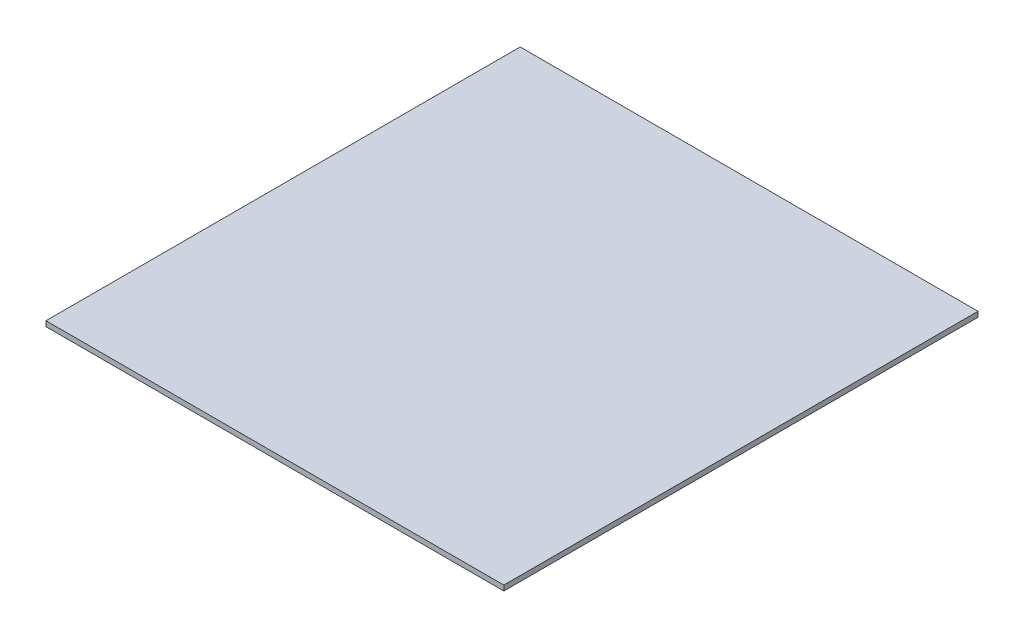
ISO-10303-21;
HEADER;
FILE_DESCRIPTION(('STEP AP214'),'2;1');
FILE_NAME('part.step','',(''),(''),'','','');
FILE_SCHEMA(('AUTOMOTIVE_DESIGN { 1 0 10303 214 1 1 1 1 }'));
ENDSEC;
DATA;
#1=APPLICATION_CONTEXT('core data for automotive mechanical design processes');
#2=APPLICATION_PROTOCOL_DEFINITION('international standard','automotive_design',2000,#1);
#3=PRODUCT_CONTEXT('',#1,'mechanical');
#4=PRODUCT('Part','Part','',(#3));
#5=PRODUCT_RELATED_PRODUCT_CATEGORY('part','',(#4));
#6=PRODUCT_DEFINITION_FORMATION('','',#4);
#7=PRODUCT_DEFINITION_CONTEXT('part definition',#1,'design');
#8=PRODUCT_DEFINITION('design','',#6,#7);
#9=PRODUCT_DEFINITION_SHAPE('','',#8);
#10=(LENGTH_UNIT() NAMED_UNIT(*) SI_UNIT(.MILLI.,.METRE.));
#11=(NAMED_UNIT(*) PLANE_ANGLE_UNIT() SI_UNIT($,.RADIAN.));
#12=(NAMED_UNIT(*) SI_UNIT($,.STERADIAN.) SOLID_ANGLE_UNIT());
#13=UNCERTAINTY_MEASURE_WITH_UNIT(LENGTH_MEASURE(1.E-05),#10,'distance_accuracy_value','');
#14=(GEOMETRIC_REPRESENTATION_CONTEXT(3) GLOBAL_UNCERTAINTY_ASSIGNED_CONTEXT((#13)) GLOBAL_UNIT_ASSIGNED_CONTEXT((#10,
#11,#12)) REPRESENTATION_CONTEXT('',''));
#15=CARTESIAN_POINT('',(0.,0.,0.));
#16=DIRECTION('',(0.,0.,1.));
#17=DIRECTION('',(1.,0.,0.));
#18=AXIS2_PLACEMENT_3D('',#15,#16,#17);
#19=CARTESIAN_POINT('',(140.,1.5875,290.));
#20=DIRECTION('',(-1.,0.,0.));
#21=DIRECTION('',(0.,0.,1.));
#22=AXIS2_PLACEMENT_3D('',#19,#20,#21);
#23=PLANE('',#22);
#24=DIRECTION('',(0.,1.,0.));
#25=VECTOR('',#24,1.);
#26=CARTESIAN_POINT('',(140.,1.5875,0.));
#27=LINE('',#26,#25);
#28=CARTESIAN_POINT('',(140.,-1.5875,0.));
#29=VERTEX_POINT('',#28);
#30=CARTESIAN_POINT('',(140.,1.5875,0.));
#31=VERTEX_POINT('',#30);
#32=EDGE_CURVE('E104',#29,#31,#27,.T.);
#33=ORIENTED_EDGE('',*,*,#32,.T.);
#34=DIRECTION('',(0.,0.,-1.));
#35=VECTOR('',#34,1.);
#36=CARTESIAN_POINT('',(140.,1.5875,290.));
#37=LINE('',#36,#35);
#38=CARTESIAN_POINT('',(140.,1.5875,290.));
#39=VERTEX_POINT('',#38);
#40=EDGE_CURVE('E11',#39,#31,#37,.T.);
#41=ORIENTED_EDGE('',*,*,#40,.F.);
#42=DIRECTION('',(0.,1.,0.));
#43=VECTOR('',#42,1.);
#44=CARTESIAN_POINT('',(140.,1.5875,290.));
#45=LINE('',#44,#43);
#46=CARTESIAN_POINT('',(140.,-1.5875,290.));
#47=VERTEX_POINT('',#46);
#48=EDGE_CURVE('E92',#47,#39,#45,.T.);
#49=ORIENTED_EDGE('',*,*,#48,.F.);
#50=DIRECTION('',(0.,0.,-1.));
#51=VECTOR('',#50,1.);
#52=CARTESIAN_POINT('',(140.,-1.5875,290.));
#53=LINE('',#52,#51);
#54=EDGE_CURVE('E100',#47,#29,#53,.T.);
#55=ORIENTED_EDGE('',*,*,#54,.T.);
#56=EDGE_LOOP('',(#33,#41,#49,#55));
#57=FACE_BOUND('',#56,.T.);
#58=ADVANCED_FACE('F41',(#57),#23,.F.);
#59=CARTESIAN_POINT('',(-140.,1.5875,290.));
#60=DIRECTION('',(0.,-1.,0.));
#61=DIRECTION('',(0.,0.,-1.));
#62=AXIS2_PLACEMENT_3D('',#59,#60,#61);
#63=PLANE('',#62);
#64=DIRECTION('',(-1.,0.,0.));
#65=VECTOR('',#64,1.);
#66=CARTESIAN_POINT('',(-140.,1.5875,0.));
#67=LINE('',#66,#65);
#68=CARTESIAN_POINT('',(-140.,1.5875,0.));
#69=VERTEX_POINT('',#68);
#70=EDGE_CURVE('E96',#31,#69,#67,.T.);
#71=ORIENTED_EDGE('',*,*,#70,.T.);
#72=DIRECTION('',(0.,0.,-1.));
#73=VECTOR('',#72,1.);
#74=CARTESIAN_POINT('',(-140.,1.5875,290.));
#75=LINE('',#74,#73);
#76=CARTESIAN_POINT('',(-140.,1.5875,290.));
#77=VERTEX_POINT('',#76);
#78=EDGE_CURVE('E49',#77,#69,#75,.T.);
#79=ORIENTED_EDGE('',*,*,#78,.F.);
#80=DIRECTION('',(-1.,0.,0.));
#81=VECTOR('',#80,1.);
#82=CARTESIAN_POINT('',(-140.,1.5875,290.));
#83=LINE('',#82,#81);
#84=EDGE_CURVE('E87',#39,#77,#83,.T.);
#85=ORIENTED_EDGE('',*,*,#84,.F.);
#86=ORIENTED_EDGE('',*,*,#40,.T.);
#87=EDGE_LOOP('',(#71,#79,#85,#86));
#88=FACE_BOUND('',#87,.T.);
#89=ADVANCED_FACE('F95',(#88),#63,.F.);
#90=CARTESIAN_POINT('',(-140.,1.5875,290.));
#91=DIRECTION('',(1.,0.,0.));
#92=DIRECTION('',(0.,0.,-1.));
#93=AXIS2_PLACEMENT_3D('',#90,#91,#92);
#94=PLANE('',#93);
#95=DIRECTION('',(0.,-1.,0.));
#96=VECTOR('',#95,1.);
#97=CARTESIAN_POINT('',(-140.,1.5875,0.));
#98=LINE('',#97,#96);
#99=CARTESIAN_POINT('',(-140.,-1.5875,0.));
#100=VERTEX_POINT('',#99);
#101=EDGE_CURVE('E74',#69,#100,#98,.T.);
#102=ORIENTED_EDGE('',*,*,#101,.T.);
#103=DIRECTION('',(0.,0.,-1.));
#104=VECTOR('',#103,1.);
#105=CARTESIAN_POINT('',(-140.,-1.5875,290.));
#106=LINE('',#105,#104);
#107=CARTESIAN_POINT('',(-140.,-1.5875,290.));
#108=VERTEX_POINT('',#107);
#109=EDGE_CURVE('E97',#108,#100,#106,.T.);
#110=ORIENTED_EDGE('',*,*,#109,.F.);
#111=DIRECTION('',(0.,-1.,0.));
#112=VECTOR('',#111,1.);
#113=CARTESIAN_POINT('',(-140.,1.5875,290.));
#114=LINE('',#113,#112);
#115=EDGE_CURVE('E90',#77,#108,#114,.T.);
#116=ORIENTED_EDGE('',*,*,#115,.F.);
#117=ORIENTED_EDGE('',*,*,#78,.T.);
#118=EDGE_LOOP('',(#102,#110,#116,#117));
#119=FACE_BOUND('',#118,.T.);
#120=ADVANCED_FACE('F98',(#119),#94,.F.);
#121=CARTESIAN_POINT('',(-140.,-1.5875,290.));
#122=DIRECTION('',(0.,1.,0.));
#123=DIRECTION('',(0.,0.,1.));
#124=AXIS2_PLACEMENT_3D('',#121,#122,#123);
#125=PLANE('',#124);
#126=DIRECTION('',(1.,0.,0.));
#127=VECTOR('',#126,1.);
#128=CARTESIAN_POINT('',(-140.,-1.5875,0.));
#129=LINE('',#128,#127);
#130=EDGE_CURVE('E80',#100,#29,#129,.T.);
#131=ORIENTED_EDGE('',*,*,#130,.T.);
#132=ORIENTED_EDGE('',*,*,#54,.F.);
#133=DIRECTION('',(1.,0.,0.));
#134=VECTOR('',#133,1.);
#135=CARTESIAN_POINT('',(-140.,-1.5875,290.));
#136=LINE('',#135,#134);
#137=EDGE_CURVE('E57',#108,#47,#136,.T.);
#138=ORIENTED_EDGE('',*,*,#137,.F.);
#139=ORIENTED_EDGE('',*,*,#109,.T.);
#140=EDGE_LOOP('',(#131,#132,#138,#139));
#141=FACE_BOUND('',#140,.T.);
#142=ADVANCED_FACE('F111',(#141),#125,.F.);
#143=CARTESIAN_POINT('',(0.,0.,290.));
#144=DIRECTION('',(0.,0.,1.));
#145=DIRECTION('',(1.,0.,0.));
#146=AXIS2_PLACEMENT_3D('',#143,#144,#145);
#147=PLANE('',#146);
#148=ORIENTED_EDGE('',*,*,#48,.T.);
#149=ORIENTED_EDGE('',*,*,#84,.T.);
#150=ORIENTED_EDGE('',*,*,#115,.T.);
#151=ORIENTED_EDGE('',*,*,#137,.T.);
#152=EDGE_LOOP('',(#148,#149,#150,#151));
#153=FACE_BOUND('',#152,.T.);
#154=ADVANCED_FACE('F88',(#153),#147,.T.);
#155=CARTESIAN_POINT('',(0.,0.,0.));
#156=DIRECTION('',(0.,0.,1.));
#157=DIRECTION('',(1.,0.,0.));
#158=AXIS2_PLACEMENT_3D('',#155,#156,#157);
#159=PLANE('',#158);
#160=ORIENTED_EDGE('',*,*,#32,.F.);
#161=ORIENTED_EDGE('',*,*,#130,.F.);
#162=ORIENTED_EDGE('',*,*,#101,.F.);
#163=ORIENTED_EDGE('',*,*,#70,.F.);
#164=EDGE_LOOP('',(#160,#161,#162,#163));
#165=FACE_BOUND('',#164,.T.);
#166=ADVANCED_FACE('F114',(#165),#159,.F.);
#167=CLOSED_SHELL('',(#58,#89,#120,#142,#154,#166));
#168=MANIFOLD_SOLID_BREP('B2',#167);
#169=ADVANCED_BREP_SHAPE_REPRESENTATION('',(#18,#168),#14);
#170=SHAPE_DEFINITION_REPRESENTATION(#9,#169);
ENDSEC;
END-ISO-10303-21;
